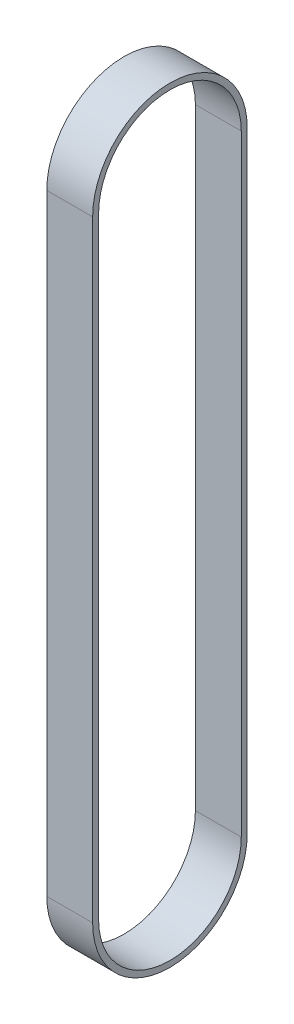
ISO-10303-21;
HEADER;
FILE_DESCRIPTION(('STEP AP214'),'2;1');
FILE_NAME('part.step','',(''),(''),'','','');
FILE_SCHEMA(('AUTOMOTIVE_DESIGN { 1 0 10303 214 1 1 1 1 }'));
ENDSEC;
DATA;
#1=APPLICATION_CONTEXT('core data for automotive mechanical design processes');
#2=APPLICATION_PROTOCOL_DEFINITION('international standard','automotive_design',2000,#1);
#3=PRODUCT_CONTEXT('',#1,'mechanical');
#4=PRODUCT('Part','Part','',(#3));
#5=PRODUCT_RELATED_PRODUCT_CATEGORY('part','',(#4));
#6=PRODUCT_DEFINITION_FORMATION('','',#4);
#7=PRODUCT_DEFINITION_CONTEXT('part definition',#1,'design');
#8=PRODUCT_DEFINITION('design','',#6,#7);
#9=PRODUCT_DEFINITION_SHAPE('','',#8);
#10=(LENGTH_UNIT() NAMED_UNIT(*) SI_UNIT(.MILLI.,.METRE.));
#11=(NAMED_UNIT(*) PLANE_ANGLE_UNIT() SI_UNIT($,.RADIAN.));
#12=(NAMED_UNIT(*) SI_UNIT($,.STERADIAN.) SOLID_ANGLE_UNIT());
#13=UNCERTAINTY_MEASURE_WITH_UNIT(LENGTH_MEASURE(1.E-05),#10,'distance_accuracy_value','');
#14=(GEOMETRIC_REPRESENTATION_CONTEXT(3) GLOBAL_UNCERTAINTY_ASSIGNED_CONTEXT((#13)) GLOBAL_UNIT_ASSIGNED_CONTEXT((#10,
#11,#12)) REPRESENTATION_CONTEXT('',''));
#15=CARTESIAN_POINT('',(0.,0.,0.));
#16=DIRECTION('',(0.,0.,1.));
#17=DIRECTION('',(1.,0.,0.));
#18=AXIS2_PLACEMENT_3D('',#15,#16,#17);
#19=CARTESIAN_POINT('',(60.6375,0.,0.));
#20=DIRECTION('',(1.,0.,0.));
#21=DIRECTION('',(0.,0.,-1.));
#22=AXIS2_PLACEMENT_3D('',#19,#20,#21);
#23=CYLINDRICAL_SURFACE('',#22,15.17);
#24=DIRECTION('',(1.,0.,0.));
#25=VECTOR('',#24,1.);
#26=CARTESIAN_POINT('',(60.6375,0.,-15.17));
#27=LINE('',#26,#25);
#28=CARTESIAN_POINT('',(60.6375,0.,-15.17));
#29=VERTEX_POINT('',#28);
#30=CARTESIAN_POINT('',(69.6375,0.,-15.17));
#31=VERTEX_POINT('',#30);
#32=EDGE_CURVE('E48',#29,#31,#27,.T.);
#33=ORIENTED_EDGE('',*,*,#32,.T.);
#34=CARTESIAN_POINT('',(69.6375,0.,0.));
#35=DIRECTION('',(1.,0.,0.));
#36=DIRECTION('',(0.,0.,-1.));
#37=AXIS2_PLACEMENT_3D('',#34,#35,#36);
#38=CIRCLE('',#37,15.17);
#39=CARTESIAN_POINT('',(69.6375,0.,15.17));
#40=VERTEX_POINT('',#39);
#41=EDGE_CURVE('E140',#40,#31,#38,.T.);
#42=ORIENTED_EDGE('',*,*,#41,.F.);
#43=DIRECTION('',(1.,0.,0.));
#44=VECTOR('',#43,1.);
#45=CARTESIAN_POINT('',(60.6375,0.,15.17));
#46=LINE('',#45,#44);
#47=CARTESIAN_POINT('',(60.6375,0.,15.17));
#48=VERTEX_POINT('',#47);
#49=EDGE_CURVE('E11',#48,#40,#46,.T.);
#50=ORIENTED_EDGE('',*,*,#49,.F.);
#51=CARTESIAN_POINT('',(60.6375,0.,0.));
#52=DIRECTION('',(1.,0.,0.));
#53=DIRECTION('',(0.,0.,-1.));
#54=AXIS2_PLACEMENT_3D('',#51,#52,#53);
#55=CIRCLE('',#54,15.17);
#56=EDGE_CURVE('E159',#48,#29,#55,.T.);
#57=ORIENTED_EDGE('',*,*,#56,.T.);
#58=EDGE_LOOP('',(#33,#42,#50,#57));
#59=FACE_BOUND('',#58,.T.);
#60=ADVANCED_FACE('F45',(#59),#23,.T.);
#61=CARTESIAN_POINT('',(60.6375,120.,15.17));
#62=DIRECTION('',(0.,0.,1.));
#63=DIRECTION('',(1.,0.,0.));
#64=AXIS2_PLACEMENT_3D('',#61,#62,#63);
#65=PLANE('',#64);
#66=ORIENTED_EDGE('',*,*,#49,.T.);
#67=DIRECTION('',(0.,-1.,0.));
#68=VECTOR('',#67,1.);
#69=CARTESIAN_POINT('',(69.6375,120.,15.17));
#70=LINE('',#69,#68);
#71=CARTESIAN_POINT('',(69.6375,120.,15.17));
#72=VERTEX_POINT('',#71);
#73=EDGE_CURVE('E149',#72,#40,#70,.T.);
#74=ORIENTED_EDGE('',*,*,#73,.F.);
#75=DIRECTION('',(1.,0.,0.));
#76=VECTOR('',#75,1.);
#77=CARTESIAN_POINT('',(60.6375,120.,15.17));
#78=LINE('',#77,#76);
#79=CARTESIAN_POINT('',(60.6375,120.,15.17));
#80=VERTEX_POINT('',#79);
#81=EDGE_CURVE('E53',#80,#72,#78,.T.);
#82=ORIENTED_EDGE('',*,*,#81,.F.);
#83=DIRECTION('',(0.,-1.,0.));
#84=VECTOR('',#83,1.);
#85=CARTESIAN_POINT('',(60.6375,120.,15.17));
#86=LINE('',#85,#84);
#87=EDGE_CURVE('E170',#80,#48,#86,.T.);
#88=ORIENTED_EDGE('',*,*,#87,.T.);
#89=EDGE_LOOP('',(#66,#74,#82,#88));
#90=FACE_BOUND('',#89,.T.);
#91=ADVANCED_FACE('F182',(#90),#65,.T.);
#92=CARTESIAN_POINT('',(60.6375,120.,0.));
#93=DIRECTION('',(1.,0.,0.));
#94=DIRECTION('',(0.,0.,-1.));
#95=AXIS2_PLACEMENT_3D('',#92,#93,#94);
#96=CYLINDRICAL_SURFACE('',#95,15.17);
#97=ORIENTED_EDGE('',*,*,#81,.T.);
#98=CARTESIAN_POINT('',(69.6375,120.,0.));
#99=DIRECTION('',(1.,0.,0.));
#100=DIRECTION('',(0.,0.,-1.));
#101=AXIS2_PLACEMENT_3D('',#98,#99,#100);
#102=CIRCLE('',#101,15.17);
#103=CARTESIAN_POINT('',(69.6375,120.,-15.17));
#104=VERTEX_POINT('',#103);
#105=EDGE_CURVE('E146',#104,#72,#102,.T.);
#106=ORIENTED_EDGE('',*,*,#105,.F.);
#107=DIRECTION('',(1.,0.,0.));
#108=VECTOR('',#107,1.);
#109=CARTESIAN_POINT('',(60.6375,120.,-15.17));
#110=LINE('',#109,#108);
#111=CARTESIAN_POINT('',(60.6375,120.,-15.17));
#112=VERTEX_POINT('',#111);
#113=EDGE_CURVE('E173',#112,#104,#110,.T.);
#114=ORIENTED_EDGE('',*,*,#113,.F.);
#115=CARTESIAN_POINT('',(60.6375,120.,0.));
#116=DIRECTION('',(1.,0.,0.));
#117=DIRECTION('',(0.,0.,-1.));
#118=AXIS2_PLACEMENT_3D('',#115,#116,#117);
#119=CIRCLE('',#118,15.17);
#120=EDGE_CURVE('E167',#112,#80,#119,.T.);
#121=ORIENTED_EDGE('',*,*,#120,.T.);
#122=EDGE_LOOP('',(#97,#106,#114,#121));
#123=FACE_BOUND('',#122,.T.);
#124=ADVANCED_FACE('F188',(#123),#96,.T.);
#125=CARTESIAN_POINT('',(60.6375,0.,-15.17));
#126=DIRECTION('',(0.,0.,-1.));
#127=DIRECTION('',(-1.,0.,0.));
#128=AXIS2_PLACEMENT_3D('',#125,#126,#127);
#129=PLANE('',#128);
#130=ORIENTED_EDGE('',*,*,#113,.T.);
#131=DIRECTION('',(0.,1.,0.));
#132=VECTOR('',#131,1.);
#133=CARTESIAN_POINT('',(69.6375,0.,-15.17));
#134=LINE('',#133,#132);
#135=EDGE_CURVE('E143',#31,#104,#134,.T.);
#136=ORIENTED_EDGE('',*,*,#135,.F.);
#137=ORIENTED_EDGE('',*,*,#32,.F.);
#138=DIRECTION('',(0.,1.,0.));
#139=VECTOR('',#138,1.);
#140=CARTESIAN_POINT('',(60.6375,0.,-15.17));
#141=LINE('',#140,#139);
#142=EDGE_CURVE('E164',#29,#112,#141,.T.);
#143=ORIENTED_EDGE('',*,*,#142,.T.);
#144=EDGE_LOOP('',(#130,#136,#137,#143));
#145=FACE_BOUND('',#144,.T.);
#146=ADVANCED_FACE('F177',(#145),#129,.T.);
#147=CARTESIAN_POINT('',(60.6375,0.,0.));
#148=DIRECTION('',(1.,0.,0.));
#149=DIRECTION('',(0.,0.,-1.));
#150=AXIS2_PLACEMENT_3D('',#147,#148,#149);
#151=PLANE('',#150);
#152=DIRECTION('',(0.,1.,0.));
#153=VECTOR('',#152,1.);
#154=CARTESIAN_POINT('',(60.6375,120.,-14.));
#155=LINE('',#154,#153);
#156=CARTESIAN_POINT('',(60.6375,0.,-14.));
#157=VERTEX_POINT('',#156);
#158=CARTESIAN_POINT('',(60.6375,120.,-14.));
#159=VERTEX_POINT('',#158);
#160=EDGE_CURVE('E122',#157,#159,#155,.T.);
#161=ORIENTED_EDGE('',*,*,#160,.T.);
#162=CARTESIAN_POINT('',(60.6375,120.,0.));
#163=DIRECTION('',(1.,0.,0.));
#164=DIRECTION('',(0.,0.,-1.));
#165=AXIS2_PLACEMENT_3D('',#162,#163,#164);
#166=CIRCLE('',#165,14.);
#167=CARTESIAN_POINT('',(60.6375,120.,14.));
#168=VERTEX_POINT('',#167);
#169=EDGE_CURVE('E152',#159,#168,#166,.T.);
#170=ORIENTED_EDGE('',*,*,#169,.T.);
#171=DIRECTION('',(0.,-1.,0.));
#172=VECTOR('',#171,1.);
#173=CARTESIAN_POINT('',(60.6375,120.,14.));
#174=LINE('',#173,#172);
#175=CARTESIAN_POINT('',(60.6375,0.,14.));
#176=VERTEX_POINT('',#175);
#177=EDGE_CURVE('E117',#168,#176,#174,.T.);
#178=ORIENTED_EDGE('',*,*,#177,.T.);
#179=CARTESIAN_POINT('',(60.6375,0.,0.));
#180=DIRECTION('',(1.,0.,0.));
#181=DIRECTION('',(0.,0.,-1.));
#182=AXIS2_PLACEMENT_3D('',#179,#180,#181);
#183=CIRCLE('',#182,14.);
#184=EDGE_CURVE('E61',#176,#157,#183,.T.);
#185=ORIENTED_EDGE('',*,*,#184,.T.);
#186=EDGE_LOOP('',(#161,#170,#178,#185));
#187=FACE_BOUND('',#186,.T.);
#188=ORIENTED_EDGE('',*,*,#56,.F.);
#189=ORIENTED_EDGE('',*,*,#87,.F.);
#190=ORIENTED_EDGE('',*,*,#120,.F.);
#191=ORIENTED_EDGE('',*,*,#142,.F.);
#192=EDGE_LOOP('',(#188,#189,#190,#191));
#193=FACE_BOUND('',#192,.T.);
#194=ADVANCED_FACE('F186',(#187,#193),#151,.F.);
#195=CARTESIAN_POINT('',(60.6375,120.,0.));
#196=DIRECTION('',(1.,0.,0.));
#197=DIRECTION('',(0.,0.,-1.));
#198=AXIS2_PLACEMENT_3D('',#195,#196,#197);
#199=CYLINDRICAL_SURFACE('',#198,14.);
#200=DIRECTION('',(1.,0.,0.));
#201=VECTOR('',#200,1.);
#202=CARTESIAN_POINT('',(60.6375,120.,-14.));
#203=LINE('',#202,#201);
#204=CARTESIAN_POINT('',(69.6375,120.,-14.));
#205=VERTEX_POINT('',#204);
#206=EDGE_CURVE('E127',#159,#205,#203,.T.);
#207=ORIENTED_EDGE('',*,*,#206,.T.);
#208=CARTESIAN_POINT('',(69.6375,120.,0.));
#209=DIRECTION('',(1.,0.,0.));
#210=DIRECTION('',(0.,0.,-1.));
#211=AXIS2_PLACEMENT_3D('',#208,#209,#210);
#212=CIRCLE('',#211,14.);
#213=CARTESIAN_POINT('',(69.6375,120.,14.));
#214=VERTEX_POINT('',#213);
#215=EDGE_CURVE('E125',#205,#214,#212,.T.);
#216=ORIENTED_EDGE('',*,*,#215,.T.);
#217=DIRECTION('',(1.,0.,0.));
#218=VECTOR('',#217,1.);
#219=CARTESIAN_POINT('',(60.6375,120.,14.));
#220=LINE('',#219,#218);
#221=EDGE_CURVE('E110',#168,#214,#220,.T.);
#222=ORIENTED_EDGE('',*,*,#221,.F.);
#223=ORIENTED_EDGE('',*,*,#169,.F.);
#224=EDGE_LOOP('',(#207,#216,#222,#223));
#225=FACE_BOUND('',#224,.T.);
#226=ADVANCED_FACE('F126',(#225),#199,.F.);
#227=CARTESIAN_POINT('',(60.6375,120.,-14.));
#228=DIRECTION('',(0.,0.,-1.));
#229=DIRECTION('',(0.,1.,0.));
#230=AXIS2_PLACEMENT_3D('',#227,#228,#229);
#231=PLANE('',#230);
#232=DIRECTION('',(1.,0.,0.));
#233=VECTOR('',#232,1.);
#234=CARTESIAN_POINT('',(60.6375,0.,-14.));
#235=LINE('',#234,#233);
#236=CARTESIAN_POINT('',(69.6375,0.,-14.));
#237=VERTEX_POINT('',#236);
#238=EDGE_CURVE('E160',#157,#237,#235,.T.);
#239=ORIENTED_EDGE('',*,*,#238,.T.);
#240=DIRECTION('',(0.,1.,0.));
#241=VECTOR('',#240,1.);
#242=CARTESIAN_POINT('',(69.6375,120.,-14.));
#243=LINE('',#242,#241);
#244=EDGE_CURVE('E136',#237,#205,#243,.T.);
#245=ORIENTED_EDGE('',*,*,#244,.T.);
#246=ORIENTED_EDGE('',*,*,#206,.F.);
#247=ORIENTED_EDGE('',*,*,#160,.F.);
#248=EDGE_LOOP('',(#239,#245,#246,#247));
#249=FACE_BOUND('',#248,.T.);
#250=ADVANCED_FACE('F233',(#249),#231,.F.);
#251=CARTESIAN_POINT('',(60.6375,0.,0.));
#252=DIRECTION('',(1.,0.,0.));
#253=DIRECTION('',(0.,0.,-1.));
#254=AXIS2_PLACEMENT_3D('',#251,#252,#253);
#255=CYLINDRICAL_SURFACE('',#254,14.);
#256=DIRECTION('',(1.,0.,0.));
#257=VECTOR('',#256,1.);
#258=CARTESIAN_POINT('',(60.6375,0.,14.));
#259=LINE('',#258,#257);
#260=CARTESIAN_POINT('',(69.6375,0.,14.));
#261=VERTEX_POINT('',#260);
#262=EDGE_CURVE('E121',#176,#261,#259,.T.);
#263=ORIENTED_EDGE('',*,*,#262,.T.);
#264=CARTESIAN_POINT('',(69.6375,0.,0.));
#265=DIRECTION('',(1.,0.,0.));
#266=DIRECTION('',(0.,0.,-1.));
#267=AXIS2_PLACEMENT_3D('',#264,#265,#266);
#268=CIRCLE('',#267,14.);
#269=EDGE_CURVE('E134',#261,#237,#268,.T.);
#270=ORIENTED_EDGE('',*,*,#269,.T.);
#271=ORIENTED_EDGE('',*,*,#238,.F.);
#272=ORIENTED_EDGE('',*,*,#184,.F.);
#273=EDGE_LOOP('',(#263,#270,#271,#272));
#274=FACE_BOUND('',#273,.T.);
#275=ADVANCED_FACE('F242',(#274),#255,.F.);
#276=CARTESIAN_POINT('',(60.6375,120.,14.));
#277=DIRECTION('',(0.,0.,1.));
#278=DIRECTION('',(0.,-1.,0.));
#279=AXIS2_PLACEMENT_3D('',#276,#277,#278);
#280=PLANE('',#279);
#281=ORIENTED_EDGE('',*,*,#221,.T.);
#282=DIRECTION('',(0.,-1.,0.));
#283=VECTOR('',#282,1.);
#284=CARTESIAN_POINT('',(69.6375,120.,14.));
#285=LINE('',#284,#283);
#286=EDGE_CURVE('E114',#214,#261,#285,.T.);
#287=ORIENTED_EDGE('',*,*,#286,.T.);
#288=ORIENTED_EDGE('',*,*,#262,.F.);
#289=ORIENTED_EDGE('',*,*,#177,.F.);
#290=EDGE_LOOP('',(#281,#287,#288,#289));
#291=FACE_BOUND('',#290,.T.);
#292=ADVANCED_FACE('F112',(#291),#280,.F.);
#293=CARTESIAN_POINT('',(69.6375,0.,0.));
#294=DIRECTION('',(1.,0.,0.));
#295=DIRECTION('',(0.,0.,-1.));
#296=AXIS2_PLACEMENT_3D('',#293,#294,#295);
#297=PLANE('',#296);
#298=ORIENTED_EDGE('',*,*,#41,.T.);
#299=ORIENTED_EDGE('',*,*,#135,.T.);
#300=ORIENTED_EDGE('',*,*,#105,.T.);
#301=ORIENTED_EDGE('',*,*,#73,.T.);
#302=EDGE_LOOP('',(#298,#299,#300,#301));
#303=FACE_BOUND('',#302,.T.);
#304=ORIENTED_EDGE('',*,*,#286,.F.);
#305=ORIENTED_EDGE('',*,*,#215,.F.);
#306=ORIENTED_EDGE('',*,*,#244,.F.);
#307=ORIENTED_EDGE('',*,*,#269,.F.);
#308=EDGE_LOOP('',(#304,#305,#306,#307));
#309=FACE_BOUND('',#308,.T.);
#310=ADVANCED_FACE('F132',(#303,#309),#297,.T.);
#311=CLOSED_SHELL('',(#60,#91,#124,#146,#194,#226,#250,#275,#292,#310));
#312=MANIFOLD_SOLID_BREP('B2',#311);
#313=ADVANCED_BREP_SHAPE_REPRESENTATION('',(#18,#312),#14);
#314=SHAPE_DEFINITION_REPRESENTATION(#9,#313);
ENDSEC;
END-ISO-10303-21;
